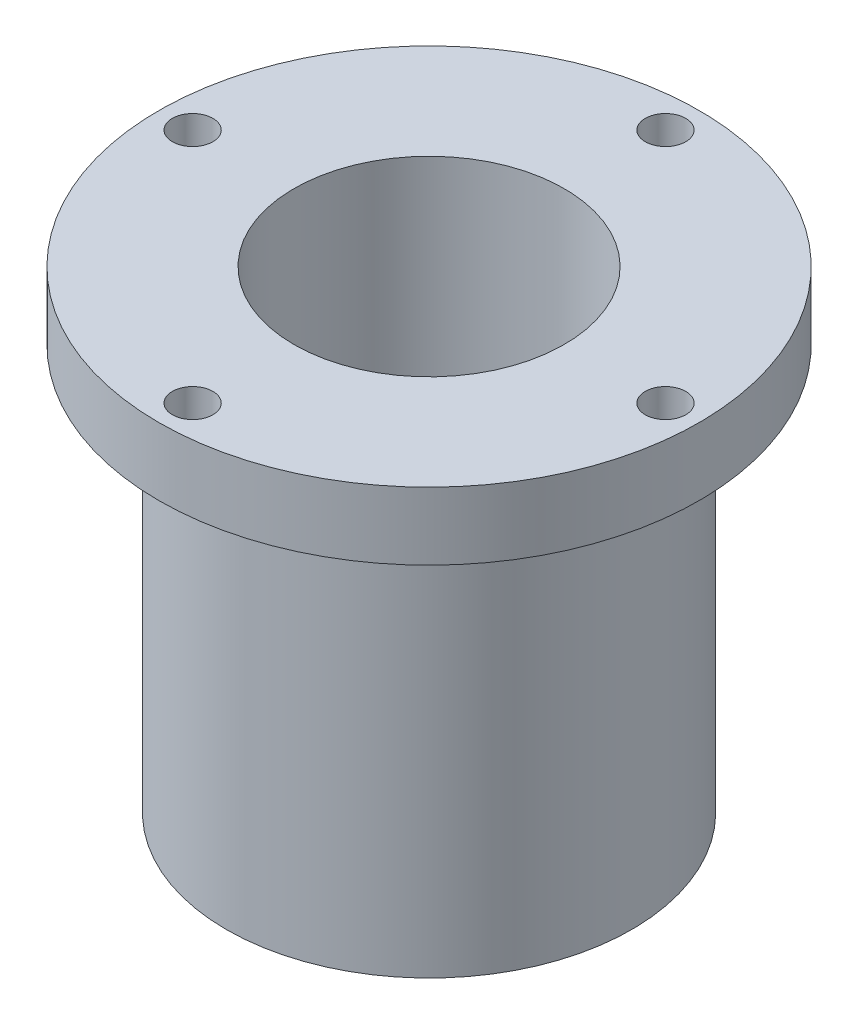
ISO-10303-21;
HEADER;
FILE_DESCRIPTION(('STEP AP214'),'2;1');
FILE_NAME('part.step','',(''),(''),'','','');
FILE_SCHEMA(('AUTOMOTIVE_DESIGN { 1 0 10303 214 1 1 1 1 }'));
ENDSEC;
DATA;
#1=APPLICATION_CONTEXT('core data for automotive mechanical design processes');
#2=APPLICATION_PROTOCOL_DEFINITION('international standard','automotive_design',2000,#1);
#3=PRODUCT_CONTEXT('',#1,'mechanical');
#4=PRODUCT('Part','Part','',(#3));
#5=PRODUCT_RELATED_PRODUCT_CATEGORY('part','',(#4));
#6=PRODUCT_DEFINITION_FORMATION('','',#4);
#7=PRODUCT_DEFINITION_CONTEXT('part definition',#1,'design');
#8=PRODUCT_DEFINITION('design','',#6,#7);
#9=PRODUCT_DEFINITION_SHAPE('','',#8);
#10=(LENGTH_UNIT() NAMED_UNIT(*) SI_UNIT(.MILLI.,.METRE.));
#11=(NAMED_UNIT(*) PLANE_ANGLE_UNIT() SI_UNIT($,.RADIAN.));
#12=(NAMED_UNIT(*) SI_UNIT($,.STERADIAN.) SOLID_ANGLE_UNIT());
#13=UNCERTAINTY_MEASURE_WITH_UNIT(LENGTH_MEASURE(1.E-05),#10,'distance_accuracy_value','');
#14=(GEOMETRIC_REPRESENTATION_CONTEXT(3) GLOBAL_UNCERTAINTY_ASSIGNED_CONTEXT((#13)) GLOBAL_UNIT_ASSIGNED_CONTEXT((#10,
#11,#12)) REPRESENTATION_CONTEXT('',''));
#15=CARTESIAN_POINT('',(0.,0.,0.));
#16=DIRECTION('',(0.,0.,1.));
#17=DIRECTION('',(1.,0.,0.));
#18=AXIS2_PLACEMENT_3D('',#15,#16,#17);
#19=CARTESIAN_POINT('',(0.,0.,0.));
#20=DIRECTION('',(0.,1.,0.));
#21=DIRECTION('',(0.,0.,1.));
#22=AXIS2_PLACEMENT_3D('',#19,#20,#21);
#23=PLANE('',#22);
#24=CARTESIAN_POINT('',(0.,0.,0.));
#25=DIRECTION('',(0.,1.,0.));
#26=DIRECTION('',(0.,0.,1.));
#27=AXIS2_PLACEMENT_3D('',#24,#25,#26);
#28=CIRCLE('',#27,15.);
#29=CARTESIAN_POINT('',(0.,0.,15.));
#30=VERTEX_POINT('',#29);
#31=EDGE_CURVE('E47',#30,#30,#28,.T.);
#32=ORIENTED_EDGE('',*,*,#31,.F.);
#33=EDGE_LOOP('',(#32));
#34=FACE_BOUND('',#33,.T.);
#35=CARTESIAN_POINT('',(0.,0.,0.));
#36=DIRECTION('',(0.,1.,0.));
#37=DIRECTION('',(0.,0.,1.));
#38=AXIS2_PLACEMENT_3D('',#35,#36,#37);
#39=CIRCLE('',#38,10.);
#40=CARTESIAN_POINT('',(0.,0.,10.));
#41=VERTEX_POINT('',#40);
#42=EDGE_CURVE('E52',#41,#41,#39,.T.);
#43=ORIENTED_EDGE('',*,*,#42,.T.);
#44=EDGE_LOOP('',(#43));
#45=FACE_BOUND('',#44,.T.);
#46=ADVANCED_FACE('F39',(#34,#45),#23,.F.);
#47=CARTESIAN_POINT('',(0.,30.,0.));
#48=DIRECTION('',(0.,-1.,0.));
#49=DIRECTION('',(0.,0.,-1.));
#50=AXIS2_PLACEMENT_3D('',#47,#48,#49);
#51=CYLINDRICAL_SURFACE('',#50,15.);
#52=CARTESIAN_POINT('',(0.,30.,0.));
#53=DIRECTION('',(0.,1.,0.));
#54=DIRECTION('',(0.,0.,1.));
#55=AXIS2_PLACEMENT_3D('',#52,#53,#54);
#56=CIRCLE('',#55,15.);
#57=CARTESIAN_POINT('',(0.,30.,15.));
#58=VERTEX_POINT('',#57);
#59=EDGE_CURVE('E10',#58,#58,#56,.T.);
#60=ORIENTED_EDGE('',*,*,#59,.F.);
#61=EDGE_LOOP('',(#60));
#62=FACE_BOUND('',#61,.T.);
#63=ORIENTED_EDGE('',*,*,#31,.T.);
#64=EDGE_LOOP('',(#63));
#65=FACE_BOUND('',#64,.T.);
#66=ADVANCED_FACE('F41',(#62,#65),#51,.T.);
#67=CARTESIAN_POINT('',(0.,30.,0.));
#68=DIRECTION('',(0.,-1.,0.));
#69=DIRECTION('',(0.,0.,-1.));
#70=AXIS2_PLACEMENT_3D('',#67,#68,#69);
#71=CYLINDRICAL_SURFACE('',#70,10.);
#72=ORIENTED_EDGE('',*,*,#42,.F.);
#73=EDGE_LOOP('',(#72));
#74=FACE_BOUND('',#73,.T.);
#75=CARTESIAN_POINT('',(0.,35.,0.));
#76=DIRECTION('',(0.,1.,0.));
#77=DIRECTION('',(0.,0.,1.));
#78=AXIS2_PLACEMENT_3D('',#75,#76,#77);
#79=CIRCLE('',#78,10.);
#80=CARTESIAN_POINT('',(0.,35.,10.));
#81=VERTEX_POINT('',#80);
#82=EDGE_CURVE('E77',#81,#81,#79,.F.);
#83=ORIENTED_EDGE('',*,*,#82,.F.);
#84=EDGE_LOOP('',(#83));
#85=FACE_BOUND('',#84,.T.);
#86=ADVANCED_FACE('F110',(#74,#85),#71,.F.);
#87=CARTESIAN_POINT('',(0.,35.,0.));
#88=DIRECTION('',(0.,-1.,0.));
#89=DIRECTION('',(0.,0.,-1.));
#90=AXIS2_PLACEMENT_3D('',#87,#88,#89);
#91=CYLINDRICAL_SURFACE('',#90,20.);
#92=CARTESIAN_POINT('',(0.,35.,0.));
#93=DIRECTION('',(0.,1.,0.));
#94=DIRECTION('',(0.,0.,1.));
#95=AXIS2_PLACEMENT_3D('',#92,#93,#94);
#96=CIRCLE('',#95,20.);
#97=CARTESIAN_POINT('',(0.,35.,20.));
#98=VERTEX_POINT('',#97);
#99=EDGE_CURVE('E80',#98,#98,#96,.T.);
#100=ORIENTED_EDGE('',*,*,#99,.F.);
#101=EDGE_LOOP('',(#100));
#102=FACE_BOUND('',#101,.T.);
#103=CARTESIAN_POINT('',(0.,30.,0.));
#104=DIRECTION('',(0.,1.,0.));
#105=DIRECTION('',(0.,0.,1.));
#106=AXIS2_PLACEMENT_3D('',#103,#104,#105);
#107=CIRCLE('',#106,20.);
#108=CARTESIAN_POINT('',(0.,30.,20.));
#109=VERTEX_POINT('',#108);
#110=EDGE_CURVE('E59',#109,#109,#107,.T.);
#111=ORIENTED_EDGE('',*,*,#110,.T.);
#112=EDGE_LOOP('',(#111));
#113=FACE_BOUND('',#112,.T.);
#114=ADVANCED_FACE('F85',(#102,#113),#91,.T.);
#115=CARTESIAN_POINT('',(0.,35.,0.));
#116=DIRECTION('',(0.,1.,0.));
#117=DIRECTION('',(0.,0.,1.));
#118=AXIS2_PLACEMENT_3D('',#115,#116,#117);
#119=PLANE('',#118);
#120=CARTESIAN_POINT('',(17.5,35.,0.));
#121=DIRECTION('',(0.,1.,0.));
#122=DIRECTION('',(0.,0.,1.));
#123=AXIS2_PLACEMENT_3D('',#120,#121,#122);
#124=CIRCLE('',#123,1.5);
#125=CARTESIAN_POINT('',(17.5,35.,1.5));
#126=VERTEX_POINT('',#125);
#127=EDGE_CURVE('E180',#126,#126,#124,.T.);
#128=ORIENTED_EDGE('',*,*,#127,.F.);
#129=EDGE_LOOP('',(#128));
#130=FACE_BOUND('',#129,.T.);
#131=CARTESIAN_POINT('',(0.,35.,17.5));
#132=DIRECTION('',(0.,1.,0.));
#133=DIRECTION('',(0.,0.,1.));
#134=AXIS2_PLACEMENT_3D('',#131,#132,#133);
#135=CIRCLE('',#134,1.5);
#136=CARTESIAN_POINT('',(0.,35.,19.));
#137=VERTEX_POINT('',#136);
#138=EDGE_CURVE('E73',#137,#137,#135,.T.);
#139=ORIENTED_EDGE('',*,*,#138,.F.);
#140=EDGE_LOOP('',(#139));
#141=FACE_BOUND('',#140,.T.);
#142=CARTESIAN_POINT('',(-17.5,35.,-1.2220184685951E-13));
#143=DIRECTION('',(0.,1.,0.));
#144=DIRECTION('',(0.,0.,1.));
#145=AXIS2_PLACEMENT_3D('',#142,#143,#144);
#146=CIRCLE('',#145,1.5);
#147=CARTESIAN_POINT('',(-17.5,35.,1.49999999999988));
#148=VERTEX_POINT('',#147);
#149=EDGE_CURVE('E63',#148,#148,#146,.T.);
#150=ORIENTED_EDGE('',*,*,#149,.F.);
#151=EDGE_LOOP('',(#150));
#152=FACE_BOUND('',#151,.T.);
#153=CARTESIAN_POINT('',(1.83302770289265E-13,35.,-17.5));
#154=DIRECTION('',(0.,1.,0.));
#155=DIRECTION('',(0.,0.,1.));
#156=AXIS2_PLACEMENT_3D('',#153,#154,#155);
#157=CIRCLE('',#156,1.5);
#158=CARTESIAN_POINT('',(1.83302770289265E-13,35.,-16.));
#159=VERTEX_POINT('',#158);
#160=EDGE_CURVE('E60',#159,#159,#157,.T.);
#161=ORIENTED_EDGE('',*,*,#160,.F.);
#162=EDGE_LOOP('',(#161));
#163=FACE_BOUND('',#162,.T.);
#164=ORIENTED_EDGE('',*,*,#82,.T.);
#165=EDGE_LOOP('',(#164));
#166=FACE_BOUND('',#165,.T.);
#167=ORIENTED_EDGE('',*,*,#99,.T.);
#168=EDGE_LOOP('',(#167));
#169=FACE_BOUND('',#168,.T.);
#170=ADVANCED_FACE('F90',(#130,#141,#152,#163,#166,#169),#119,.T.);
#171=CARTESIAN_POINT('',(0.,30.,0.));
#172=DIRECTION('',(0.,1.,0.));
#173=DIRECTION('',(0.,0.,1.));
#174=AXIS2_PLACEMENT_3D('',#171,#172,#173);
#175=PLANE('',#174);
#176=CARTESIAN_POINT('',(17.5,30.,0.));
#177=DIRECTION('',(0.,1.,0.));
#178=DIRECTION('',(0.,0.,1.));
#179=AXIS2_PLACEMENT_3D('',#176,#177,#178);
#180=CIRCLE('',#179,1.5);
#181=CARTESIAN_POINT('',(17.5,30.,1.5));
#182=VERTEX_POINT('',#181);
#183=EDGE_CURVE('E182',#182,#182,#180,.T.);
#184=ORIENTED_EDGE('',*,*,#183,.T.);
#185=EDGE_LOOP('',(#184));
#186=FACE_BOUND('',#185,.T.);
#187=CARTESIAN_POINT('',(0.,30.,17.5));
#188=DIRECTION('',(0.,1.,0.));
#189=DIRECTION('',(0.,0.,1.));
#190=AXIS2_PLACEMENT_3D('',#187,#188,#189);
#191=CIRCLE('',#190,1.5);
#192=CARTESIAN_POINT('',(0.,30.,19.));
#193=VERTEX_POINT('',#192);
#194=EDGE_CURVE('E43',#193,#193,#191,.T.);
#195=ORIENTED_EDGE('',*,*,#194,.T.);
#196=EDGE_LOOP('',(#195));
#197=FACE_BOUND('',#196,.T.);
#198=CARTESIAN_POINT('',(-17.5,30.,-1.2220184685951E-13));
#199=DIRECTION('',(0.,1.,0.));
#200=DIRECTION('',(0.,0.,1.));
#201=AXIS2_PLACEMENT_3D('',#198,#199,#200);
#202=CIRCLE('',#201,1.5);
#203=CARTESIAN_POINT('',(-17.5,30.,1.49999999999988));
#204=VERTEX_POINT('',#203);
#205=EDGE_CURVE('E61',#204,#204,#202,.T.);
#206=ORIENTED_EDGE('',*,*,#205,.T.);
#207=EDGE_LOOP('',(#206));
#208=FACE_BOUND('',#207,.T.);
#209=CARTESIAN_POINT('',(1.83302770289265E-13,30.,-17.5));
#210=DIRECTION('',(0.,1.,0.));
#211=DIRECTION('',(0.,0.,1.));
#212=AXIS2_PLACEMENT_3D('',#209,#210,#211);
#213=CIRCLE('',#212,1.5);
#214=CARTESIAN_POINT('',(1.83302770289265E-13,30.,-16.));
#215=VERTEX_POINT('',#214);
#216=EDGE_CURVE('E57',#215,#215,#213,.T.);
#217=ORIENTED_EDGE('',*,*,#216,.T.);
#218=EDGE_LOOP('',(#217));
#219=FACE_BOUND('',#218,.T.);
#220=ORIENTED_EDGE('',*,*,#59,.T.);
#221=EDGE_LOOP('',(#220));
#222=FACE_BOUND('',#221,.T.);
#223=ORIENTED_EDGE('',*,*,#110,.F.);
#224=EDGE_LOOP('',(#223));
#225=FACE_BOUND('',#224,.T.);
#226=ADVANCED_FACE('F87',(#186,#197,#208,#219,#222,#225),#175,.F.);
#227=CARTESIAN_POINT('',(1.83302770289265E-13,35.,-17.5));
#228=DIRECTION('',(0.,1.,0.));
#229=DIRECTION('',(0.,0.,1.));
#230=AXIS2_PLACEMENT_3D('',#227,#228,#229);
#231=CYLINDRICAL_SURFACE('',#230,1.5);
#232=ORIENTED_EDGE('',*,*,#160,.T.);
#233=EDGE_LOOP('',(#232));
#234=FACE_BOUND('',#233,.T.);
#235=ORIENTED_EDGE('',*,*,#216,.F.);
#236=EDGE_LOOP('',(#235));
#237=FACE_BOUND('',#236,.T.);
#238=ADVANCED_FACE('F89',(#234,#237),#231,.F.);
#239=CARTESIAN_POINT('',(-17.5,35.,-1.2220184685951E-13));
#240=DIRECTION('',(0.,1.,0.));
#241=DIRECTION('',(0.,0.,1.));
#242=AXIS2_PLACEMENT_3D('',#239,#240,#241);
#243=CYLINDRICAL_SURFACE('',#242,1.5);
#244=ORIENTED_EDGE('',*,*,#149,.T.);
#245=EDGE_LOOP('',(#244));
#246=FACE_BOUND('',#245,.T.);
#247=ORIENTED_EDGE('',*,*,#205,.F.);
#248=EDGE_LOOP('',(#247));
#249=FACE_BOUND('',#248,.T.);
#250=ADVANCED_FACE('F97',(#246,#249),#243,.F.);
#251=CARTESIAN_POINT('',(0.,35.,17.5));
#252=DIRECTION('',(0.,1.,0.));
#253=DIRECTION('',(0.,0.,1.));
#254=AXIS2_PLACEMENT_3D('',#251,#252,#253);
#255=CYLINDRICAL_SURFACE('',#254,1.5);
#256=ORIENTED_EDGE('',*,*,#138,.T.);
#257=EDGE_LOOP('',(#256));
#258=FACE_BOUND('',#257,.T.);
#259=ORIENTED_EDGE('',*,*,#194,.F.);
#260=EDGE_LOOP('',(#259));
#261=FACE_BOUND('',#260,.T.);
#262=ADVANCED_FACE('F155',(#258,#261),#255,.F.);
#263=CARTESIAN_POINT('',(17.5,35.,0.));
#264=DIRECTION('',(0.,1.,0.));
#265=DIRECTION('',(0.,0.,1.));
#266=AXIS2_PLACEMENT_3D('',#263,#264,#265);
#267=CYLINDRICAL_SURFACE('',#266,1.5);
#268=ORIENTED_EDGE('',*,*,#127,.T.);
#269=EDGE_LOOP('',(#268));
#270=FACE_BOUND('',#269,.T.);
#271=ORIENTED_EDGE('',*,*,#183,.F.);
#272=EDGE_LOOP('',(#271));
#273=FACE_BOUND('',#272,.T.);
#274=ADVANCED_FACE('F164',(#270,#273),#267,.F.);
#275=CLOSED_SHELL('',(#46,#66,#86,#114,#170,#226,#238,#250,#262,#274));
#276=MANIFOLD_SOLID_BREP('B2',#275);
#277=ADVANCED_BREP_SHAPE_REPRESENTATION('',(#18,#276),#14);
#278=SHAPE_DEFINITION_REPRESENTATION(#9,#277);
ENDSEC;
END-ISO-10303-21;
